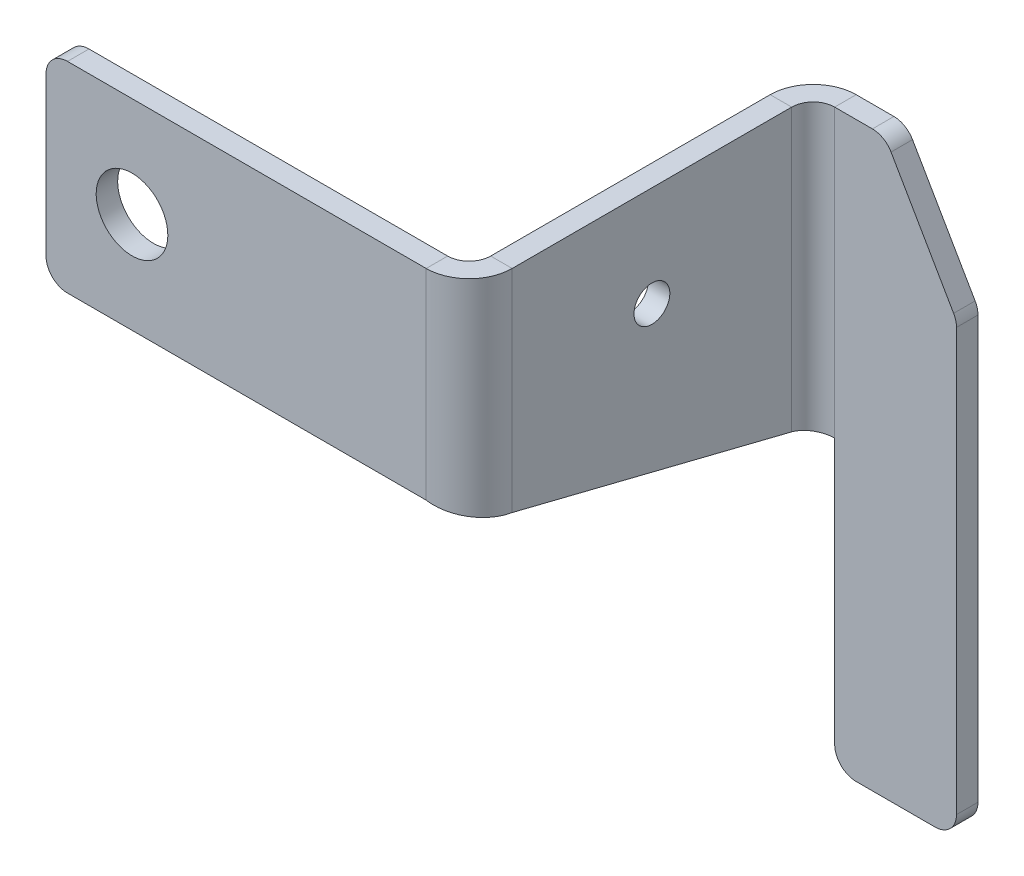
ISO-10303-21;
HEADER;
FILE_DESCRIPTION(('STEP AP214'),'2;1');
FILE_NAME('part.step','',(''),(''),'','','');
FILE_SCHEMA(('AUTOMOTIVE_DESIGN { 1 0 10303 214 1 1 1 1 }'));
ENDSEC;
DATA;
#1=APPLICATION_CONTEXT('core data for automotive mechanical design processes');
#2=APPLICATION_PROTOCOL_DEFINITION('international standard','automotive_design',2000,#1);
#3=PRODUCT_CONTEXT('',#1,'mechanical');
#4=PRODUCT('Part','Part','',(#3));
#5=PRODUCT_RELATED_PRODUCT_CATEGORY('part','',(#4));
#6=PRODUCT_DEFINITION_FORMATION('','',#4);
#7=PRODUCT_DEFINITION_CONTEXT('part definition',#1,'design');
#8=PRODUCT_DEFINITION('design','',#6,#7);
#9=PRODUCT_DEFINITION_SHAPE('','',#8);
#10=(LENGTH_UNIT() NAMED_UNIT(*) SI_UNIT(.MILLI.,.METRE.));
#11=(NAMED_UNIT(*) PLANE_ANGLE_UNIT() SI_UNIT($,.RADIAN.));
#12=(NAMED_UNIT(*) SI_UNIT($,.STERADIAN.) SOLID_ANGLE_UNIT());
#13=UNCERTAINTY_MEASURE_WITH_UNIT(LENGTH_MEASURE(1.E-05),#10,'distance_accuracy_value','');
#14=(GEOMETRIC_REPRESENTATION_CONTEXT(3) GLOBAL_UNCERTAINTY_ASSIGNED_CONTEXT((#13)) GLOBAL_UNIT_ASSIGNED_CONTEXT((#10,
#11,#12)) REPRESENTATION_CONTEXT('',''));
#15=CARTESIAN_POINT('',(0.,0.,0.));
#16=DIRECTION('',(0.,0.,1.));
#17=DIRECTION('',(1.,0.,0.));
#18=AXIS2_PLACEMENT_3D('',#15,#16,#17);
#19=CARTESIAN_POINT('',(-23.,0.,0.));
#20=DIRECTION('',(1.,0.,0.));
#21=DIRECTION('',(0.,0.,-1.));
#22=AXIS2_PLACEMENT_3D('',#19,#20,#21);
#23=PLANE('',#22);
#24=CARTESIAN_POINT('',(-23.0000000000001,66.,22.5));
#25=DIRECTION('',(-1.,0.,0.));
#26=DIRECTION('',(0.,0.,1.));
#27=AXIS2_PLACEMENT_3D('',#24,#25,#26);
#28=CIRCLE('',#27,2.5);
#29=CARTESIAN_POINT('',(-23.0000000000001,66.,25.));
#30=VERTEX_POINT('',#29);
#31=EDGE_CURVE('E578',#30,#30,#28,.T.);
#32=ORIENTED_EDGE('',*,*,#31,.F.);
#33=EDGE_LOOP('',(#32));
#34=FACE_BOUND('',#33,.T.);
#35=DIRECTION('',(0.,0.242535625036333,0.970142500145332));
#36=VECTOR('',#35,1.);
#37=CARTESIAN_POINT('',(-23.,37.6470588235294,-9.41176470588242));
#38=LINE('',#37,#36);
#39=CARTESIAN_POINT('',(-23.,40.75,2.99999999999998));
#40=VERTEX_POINT('',#39);
#41=CARTESIAN_POINT('',(-23.0000000000001,50.5,42.0000000000001));
#42=VERTEX_POINT('',#41);
#43=EDGE_CURVE('E445',#40,#42,#38,.T.);
#44=ORIENTED_EDGE('',*,*,#43,.T.);
#45=DIRECTION('',(0.,1.,0.));
#46=VECTOR('',#45,1.);
#47=CARTESIAN_POINT('',(-23.0000000000001,80.,42.));
#48=LINE('',#47,#46);
#49=CARTESIAN_POINT('',(-23.0000000000001,80.,42.));
#50=VERTEX_POINT('',#49);
#51=EDGE_CURVE('E248',#50,#42,#48,.F.);
#52=ORIENTED_EDGE('',*,*,#51,.F.);
#53=DIRECTION('',(0.,0.,-1.));
#54=VECTOR('',#53,1.);
#55=CARTESIAN_POINT('',(-23.,80.,0.));
#56=LINE('',#55,#54);
#57=CARTESIAN_POINT('',(-23.,80.,2.99999999999998));
#58=VERTEX_POINT('',#57);
#59=EDGE_CURVE('E267',#50,#58,#56,.T.);
#60=ORIENTED_EDGE('',*,*,#59,.T.);
#61=DIRECTION('',(0.,1.,0.));
#62=VECTOR('',#61,1.);
#63=CARTESIAN_POINT('',(-23.,0.,2.99999999999998));
#64=LINE('',#63,#62);
#65=EDGE_CURVE('E262',#40,#58,#64,.T.);
#66=ORIENTED_EDGE('',*,*,#65,.F.);
#67=EDGE_LOOP('',(#44,#52,#60,#66));
#68=FACE_BOUND('',#67,.T.);
#69=ADVANCED_FACE('F48',(#34,#68),#23,.F.);
#70=CARTESIAN_POINT('',(-20.,0.,0.));
#71=DIRECTION('',(1.,0.,0.));
#72=DIRECTION('',(0.,0.,-1.));
#73=AXIS2_PLACEMENT_3D('',#70,#71,#72);
#74=PLANE('',#73);
#75=CARTESIAN_POINT('',(-20.0000000000001,66.,22.5));
#76=DIRECTION('',(1.,0.,0.));
#77=DIRECTION('',(0.,0.,-1.));
#78=AXIS2_PLACEMENT_3D('',#75,#76,#77);
#79=CIRCLE('',#78,2.5);
#80=CARTESIAN_POINT('',(-20.0000000000001,66.,20.));
#81=VERTEX_POINT('',#80);
#82=EDGE_CURVE('E52',#81,#81,#79,.T.);
#83=ORIENTED_EDGE('',*,*,#82,.F.);
#84=EDGE_LOOP('',(#83));
#85=FACE_BOUND('',#84,.T.);
#86=DIRECTION('',(0.,1.,0.));
#87=VECTOR('',#86,1.);
#88=CARTESIAN_POINT('',(-20.0000000000001,80.,42.0000000000001));
#89=LINE('',#88,#87);
#90=CARTESIAN_POINT('',(-20.0000000000001,80.,42.0000000000001));
#91=VERTEX_POINT('',#90);
#92=CARTESIAN_POINT('',(-20.0000000000001,50.5,42.0000000000001));
#93=VERTEX_POINT('',#92);
#94=EDGE_CURVE('E244',#91,#93,#89,.F.);
#95=ORIENTED_EDGE('',*,*,#94,.T.);
#96=DIRECTION('',(0.,0.242535625036333,0.970142500145332));
#97=VECTOR('',#96,1.);
#98=CARTESIAN_POINT('',(-20.,37.6470588235294,-9.41176470588242));
#99=LINE('',#98,#97);
#100=CARTESIAN_POINT('',(-20.,40.75,2.99999999999999));
#101=VERTEX_POINT('',#100);
#102=EDGE_CURVE('E200',#101,#93,#99,.T.);
#103=ORIENTED_EDGE('',*,*,#102,.F.);
#104=DIRECTION('',(0.,-1.,0.));
#105=VECTOR('',#104,1.);
#106=CARTESIAN_POINT('',(-20.,80.,2.99999999999999));
#107=LINE('',#106,#105);
#108=CARTESIAN_POINT('',(-20.,80.,2.99999999999999));
#109=VERTEX_POINT('',#108);
#110=EDGE_CURVE('E259',#109,#101,#107,.T.);
#111=ORIENTED_EDGE('',*,*,#110,.F.);
#112=DIRECTION('',(0.,0.,-1.));
#113=VECTOR('',#112,1.);
#114=CARTESIAN_POINT('',(-20.,80.,0.));
#115=LINE('',#114,#113);
#116=EDGE_CURVE('E266',#91,#109,#115,.T.);
#117=ORIENTED_EDGE('',*,*,#116,.F.);
#118=EDGE_LOOP('',(#95,#103,#111,#117));
#119=FACE_BOUND('',#118,.T.);
#120=ADVANCED_FACE('F494',(#85,#119),#74,.T.);
#121=CARTESIAN_POINT('',(-17.,0.,3.));
#122=DIRECTION('',(0.,-1.,0.));
#123=DIRECTION('',(-1.,0.,0.));
#124=AXIS2_PLACEMENT_3D('',#121,#122,#123);
#125=CYLINDRICAL_SURFACE('',#124,6.);
#126=DIRECTION('',(0.,-1.,0.));
#127=VECTOR('',#126,1.);
#128=CARTESIAN_POINT('',(-17.,0.,-3.));
#129=LINE('',#128,#127);
#130=CARTESIAN_POINT('',(-17.,40.,-3.));
#131=VERTEX_POINT('',#130);
#132=CARTESIAN_POINT('',(-17.,80.,-3.));
#133=VERTEX_POINT('',#132);
#134=EDGE_CURVE('E275',#131,#133,#129,.F.);
#135=ORIENTED_EDGE('',*,*,#134,.F.);
#136=CARTESIAN_POINT('',(-17.,40.75,3.));
#137=DIRECTION('',(0.,0.992277876713668,-0.124034734589209));
#138=DIRECTION('',(0.,-0.124034734589209,-0.992277876713668));
#139=AXIS2_PLACEMENT_3D('',#136,#137,#138);
#140=ELLIPSE('',#139,6.04669331122391,6.);
#141=EDGE_CURVE('E403',#40,#131,#140,.F.);
#142=ORIENTED_EDGE('',*,*,#141,.F.);
#143=ORIENTED_EDGE('',*,*,#65,.T.);
#144=CARTESIAN_POINT('',(-17.,80.,3.));
#145=DIRECTION('',(0.,-1.,0.));
#146=DIRECTION('',(0.,0.,-1.));
#147=AXIS2_PLACEMENT_3D('',#144,#145,#146);
#148=CIRCLE('',#147,6.);
#149=EDGE_CURVE('E274',#133,#58,#148,.F.);
#150=ORIENTED_EDGE('',*,*,#149,.F.);
#151=EDGE_LOOP('',(#135,#142,#143,#150));
#152=FACE_BOUND('',#151,.T.);
#153=ADVANCED_FACE('F498',(#152),#125,.T.);
#154=CARTESIAN_POINT('',(-17.,0.,3.));
#155=DIRECTION('',(0.,-1.,0.));
#156=DIRECTION('',(-1.,0.,0.));
#157=AXIS2_PLACEMENT_3D('',#154,#155,#156);
#158=CYLINDRICAL_SURFACE('',#157,3.);
#159=CARTESIAN_POINT('',(-17.,40.75,3.));
#160=DIRECTION('',(0.,0.970142500145332,-0.242535625036333));
#161=DIRECTION('',(0.,-0.242535625036333,-0.970142500145332));
#162=AXIS2_PLACEMENT_3D('',#159,#160,#161);
#163=ELLIPSE('',#162,3.09232921921324,3.);
#164=CARTESIAN_POINT('',(-17.,40.,0.));
#165=VERTEX_POINT('',#164);
#166=EDGE_CURVE('E400',#101,#165,#163,.F.);
#167=ORIENTED_EDGE('',*,*,#166,.T.);
#168=DIRECTION('',(0.,-1.,0.));
#169=VECTOR('',#168,1.);
#170=CARTESIAN_POINT('',(-17.,0.,0.));
#171=LINE('',#170,#169);
#172=CARTESIAN_POINT('',(-17.,80.,0.));
#173=VERTEX_POINT('',#172);
#174=EDGE_CURVE('E270',#165,#173,#171,.F.);
#175=ORIENTED_EDGE('',*,*,#174,.T.);
#176=CARTESIAN_POINT('',(-17.,80.,3.));
#177=DIRECTION('',(0.,-1.,0.));
#178=DIRECTION('',(0.,0.,-1.));
#179=AXIS2_PLACEMENT_3D('',#176,#177,#178);
#180=CIRCLE('',#179,3.);
#181=EDGE_CURVE('E279',#173,#109,#180,.F.);
#182=ORIENTED_EDGE('',*,*,#181,.T.);
#183=ORIENTED_EDGE('',*,*,#110,.T.);
#184=EDGE_LOOP('',(#167,#175,#182,#183));
#185=FACE_BOUND('',#184,.T.);
#186=ADVANCED_FACE('F405',(#185),#158,.F.);
#187=CARTESIAN_POINT('',(-26.0000000000001,80.,42.));
#188=DIRECTION('',(0.,1.,0.));
#189=DIRECTION('',(0.,0.,1.));
#190=AXIS2_PLACEMENT_3D('',#187,#188,#189);
#191=CYLINDRICAL_SURFACE('',#190,6.00000000000002);
#192=DIRECTION('',(0.,-1.,0.));
#193=VECTOR('',#192,1.);
#194=CARTESIAN_POINT('',(-26.0000000000001,0.,48.0000000000002));
#195=LINE('',#194,#193);
#196=CARTESIAN_POINT('',(-26.0000000000001,80.,48.));
#197=VERTEX_POINT('',#196);
#198=CARTESIAN_POINT('',(-26.0000000000001,52.0000000000001,48.));
#199=VERTEX_POINT('',#198);
#200=EDGE_CURVE('E194',#197,#199,#195,.T.);
#201=ORIENTED_EDGE('',*,*,#200,.T.);
#202=CARTESIAN_POINT('',(-20.0000000000001,50.5,42.0000000000001));
#203=CARTESIAN_POINT('',(-19.9999809272732,50.5271988135765,42.1708884115336));
#204=CARTESIAN_POINT('',(-20.0072999109342,50.554397181265,42.3417741244732));
#205=CARTESIAN_POINT('',(-20.0364762501204,50.6087914012445,42.6822920448548));
#206=CARTESIAN_POINT('',(-20.0583328896161,50.6359872535932,42.8519243136171));
#207=CARTESIAN_POINT('',(-20.1164246131866,50.6903567100954,43.1885755944871));
#208=CARTESIAN_POINT('',(-20.1526486934209,50.7175303153643,43.3555965050813));
#209=CARTESIAN_POINT('',(-20.2392049399518,50.7718796544687,43.6859389510763));
#210=CARTESIAN_POINT('',(-20.289536930385,50.7990553882734,43.8492605325641));
#211=CARTESIAN_POINT('',(-20.4039645154131,50.853416377391,44.1710740863774));
#212=CARTESIAN_POINT('',(-20.4680649793588,50.8806016326666,44.3295643273504));
#213=CARTESIAN_POINT('',(-20.6095773554522,50.9349826984854,44.6405567010993));
#214=CARTESIAN_POINT('',(-20.6869941614229,50.9621785092287,44.7930566069973));
#215=CARTESIAN_POINT('',(-20.8545260998438,51.0165569814536,45.0908367943875));
#216=CARTESIAN_POINT('',(-20.9446363043459,51.0437396439496,45.236119848204));
#217=CARTESIAN_POINT('',(-21.1369226509117,51.0981060193544,45.5184731996396));
#218=CARTESIAN_POINT('',(-21.2390990480618,51.1252897322732,45.6555433235401));
#219=CARTESIAN_POINT('',(-21.4547676270201,51.1796585182956,45.9204637077973));
#220=CARTESIAN_POINT('',(-21.5682594316657,51.2068435913237,46.0483142752136));
#221=CARTESIAN_POINT('',(-21.8057347373319,51.2612132213563,46.2938690962732));
#222=CARTESIAN_POINT('',(-21.9297182416712,51.2883977783606,46.4115733467071));
#223=CARTESIAN_POINT('',(-22.1873052742819,51.3427731237444,46.6360054318254));
#224=CARTESIAN_POINT('',(-22.3209111828211,51.3699639119956,46.7427305346636));
#225=CARTESIAN_POINT('',(-22.5967387363472,51.4243428191225,46.9443906750948));
#226=CARTESIAN_POINT('',(-22.73896020153,51.4515309380421,47.0393259586118));
#227=CARTESIAN_POINT('',(-23.0310482738764,51.5059212937497,47.2167554377511));
#228=CARTESIAN_POINT('',(-23.1809182157006,51.5331235314881,47.299244143693));
#229=CARTESIAN_POINT('',(-23.4870951857911,51.5875184508545,47.4511009166432));
#230=CARTESIAN_POINT('',(-23.6433998426797,51.6147111323435,47.5204737654355));
#231=CARTESIAN_POINT('',(-23.9612955407474,51.6690862423085,47.645604209207));
#232=CARTESIAN_POINT('',(-24.122884396854,51.6962686704363,47.7013673531928));
#233=CARTESIAN_POINT('',(-24.4501747261215,51.7506221292656,47.7988968272606));
#234=CARTESIAN_POINT('',(-24.6158750284614,51.7777931610212,47.8406670940719));
#235=CARTESIAN_POINT('',(-24.9832093848779,51.8374945385136,47.9167441914123));
#236=CARTESIAN_POINT('',(-25.1854907718932,51.8700260149393,47.9479588860502));
#237=CARTESIAN_POINT('',(-25.5918555304715,51.935038985061,47.9895918504956));
#238=CARTESIAN_POINT('',(-25.7959355238922,51.9675204759518,48.000043121242));
#239=CARTESIAN_POINT('',(-26.0000000000001,52.,48.0000000000001));
#240=B_SPLINE_CURVE_WITH_KNOTS('',3,(#202,#203,#204,#205,#206,#207,#208,#209,#210,#211,#212,
#213,#214,#215,#216,#217,#218,#219,#220,#221,#222,#223,#224,#225,#226,#227,#228,#229,#230,#231,
#232,#233,#234,#235,#236,#237,#238,#239),.UNSPECIFIED.,.F.,.F.,(4,2,2,2,2,2,2,2,2,2,2,2,2,2,2,2,
2,2,4),(0.,0.518959550329575,1.0378935420111,1.55643085383316,2.07496170206937,2.5936762364725,
3.11258180997676,3.63128648157117,4.15000212085383,4.66870047619503,5.18739899560693,
5.70622626769461,6.22504271574306,6.74408732796646,7.26294234026479,7.78158544805828,
8.30008251901355,8.92074034643599,9.54041092196089),.UNSPECIFIED.);
#241=EDGE_CURVE('E212',#93,#199,#240,.T.);
#242=ORIENTED_EDGE('',*,*,#241,.F.);
#243=ORIENTED_EDGE('',*,*,#94,.F.);
#244=CARTESIAN_POINT('',(-26.0000000000001,80.,42.));
#245=DIRECTION('',(0.,1.,0.));
#246=DIRECTION('',(0.,0.,1.));
#247=AXIS2_PLACEMENT_3D('',#244,#245,#246);
#248=CIRCLE('',#247,6.00000000000002);
#249=EDGE_CURVE('E225',#197,#91,#248,.T.);
#250=ORIENTED_EDGE('',*,*,#249,.F.);
#251=EDGE_LOOP('',(#201,#242,#243,#250));
#252=FACE_BOUND('',#251,.T.);
#253=ADVANCED_FACE('F223',(#252),#191,.T.);
#254=CARTESIAN_POINT('',(-26.0000000000001,80.,42.));
#255=DIRECTION('',(0.,1.,0.));
#256=DIRECTION('',(0.,0.,1.));
#257=AXIS2_PLACEMENT_3D('',#254,#255,#256);
#258=CYLINDRICAL_SURFACE('',#257,3.00000000000002);
#259=CARTESIAN_POINT('',(-23.0000000000001,50.5,42.0000000000001));
#260=CARTESIAN_POINT('',(-22.9999900816324,50.5282067071287,42.0886098585475));
#261=CARTESIAN_POINT('',(-23.0039257862985,50.5564118260681,42.1772156494112));
#262=CARTESIAN_POINT('',(-23.0196122009743,50.6128193554078,42.3537286151159));
#263=CARTESIAN_POINT('',(-23.0313624967738,50.6410217658723,42.4416358267351));
#264=CARTESIAN_POINT('',(-23.0625895390688,50.697405074533,42.6160018487344));
#265=CARTESIAN_POINT('',(-23.0820601795823,50.7255859721383,42.7024617476013));
#266=CARTESIAN_POINT('',(-23.1285548790054,50.7819421245132,42.8732990209915));
#267=CARTESIAN_POINT('',(-23.1555788364569,50.8101173793535,42.9576764234709));
#268=CARTESIAN_POINT('',(-23.2477378209365,50.8946670540813,43.2067866102603));
#269=CARTESIAN_POINT('',(-23.3239710886862,50.9510850516398,43.3675591346964));
#270=CARTESIAN_POINT('',(-23.5035209009418,51.0638707755631,43.6730264769888));
#271=CARTESIAN_POINT('',(-23.6068307942003,51.1202385108672,43.8177252308805));
#272=CARTESIAN_POINT('',(-23.8372910770278,51.2329679353857,44.0866280437404));
#273=CARTESIAN_POINT('',(-23.964432402184,51.2893296187733,44.2108398613662));
#274=CARTESIAN_POINT('',(-24.2386625423282,51.4020656020957,44.4349659893948));
#275=CARTESIAN_POINT('',(-24.3857587485445,51.4584398989415,44.5348712582401));
#276=CARTESIAN_POINT('',(-24.6952860604841,51.5712113292956,44.7072371548024));
#277=CARTESIAN_POINT('',(-24.8577233815542,51.6276084627625,44.7796865988793));
#278=CARTESIAN_POINT('',(-25.1927315440526,51.7403622476882,44.8947538283525));
#279=CARTESIAN_POINT('',(-25.3652901289713,51.7967188677449,44.937406919457));
#280=CARTESIAN_POINT('',(-25.616201456582,51.8775412771971,44.976350764425));
#281=CARTESIAN_POINT('',(-25.6927625411078,51.9020560952089,44.9852215096041));
#282=CARTESIAN_POINT('',(-25.8462043645222,51.9510432094658,44.9970396467386));
#283=CARTESIAN_POINT('',(-25.9230842999591,51.9755155043361,44.9999974733351));
#284=CARTESIAN_POINT('',(-26.0000000000001,52.,45.0000000000001));
#285=B_SPLINE_CURVE_WITH_KNOTS('',3,(#259,#260,#261,#262,#263,#264,#265,#266,#267,#268,#269,
#270,#271,#272,#273,#274,#275,#276,#277,#278,#279,#280,#281,#282,#283,#284),.UNSPECIFIED.,.F.,
.F.,(4,2,2,2,2,2,2,2,2,2,2,2,4),(0.,0.27888193490708,0.55774908893085,0.836396126840666,
1.11503942207467,1.67213120677629,2.22908627251694,2.78582992570988,3.34278036102028,
3.89995741692172,4.45647314858612,4.69892817969104,4.94095496670209),.UNSPECIFIED.);
#286=CARTESIAN_POINT('',(-26.0000000000002,52.0000000000001,45.));
#287=VERTEX_POINT('',#286);
#288=EDGE_CURVE('E211',#42,#287,#285,.T.);
#289=ORIENTED_EDGE('',*,*,#288,.T.);
#290=DIRECTION('',(0.,1.,0.));
#291=VECTOR('',#290,1.);
#292=CARTESIAN_POINT('',(-26.0000000000001,40.,45.0000000000001));
#293=LINE('',#292,#291);
#294=CARTESIAN_POINT('',(-26.0000000000001,80.,45.));
#295=VERTEX_POINT('',#294);
#296=EDGE_CURVE('E233',#287,#295,#293,.T.);
#297=ORIENTED_EDGE('',*,*,#296,.T.);
#298=CARTESIAN_POINT('',(-26.0000000000001,80.,42.));
#299=DIRECTION('',(0.,1.,0.));
#300=DIRECTION('',(0.,0.,1.));
#301=AXIS2_PLACEMENT_3D('',#298,#299,#300);
#302=CIRCLE('',#301,3.00000000000002);
#303=EDGE_CURVE('E240',#295,#50,#302,.T.);
#304=ORIENTED_EDGE('',*,*,#303,.T.);
#305=ORIENTED_EDGE('',*,*,#51,.T.);
#306=EDGE_LOOP('',(#289,#297,#304,#305));
#307=FACE_BOUND('',#306,.T.);
#308=ADVANCED_FACE('F418',(#307),#258,.F.);
#309=CARTESIAN_POINT('',(0.,0.,48.0000000000002));
#310=DIRECTION('',(0.,0.,-1.));
#311=DIRECTION('',(0.,1.,0.));
#312=AXIS2_PLACEMENT_3D('',#309,#310,#311);
#313=PLANE('',#312);
#314=CARTESIAN_POINT('',(-67.0477038063071,66.,48.));
#315=DIRECTION('',(0.,0.,-1.));
#316=DIRECTION('',(0.,1.,0.));
#317=AXIS2_PLACEMENT_3D('',#314,#315,#316);
#318=CIRCLE('',#317,5.);
#319=CARTESIAN_POINT('',(-67.0477038063071,71.,48.));
#320=VERTEX_POINT('',#319);
#321=EDGE_CURVE('E306',#320,#320,#318,.T.);
#322=ORIENTED_EDGE('',*,*,#321,.T.);
#323=EDGE_LOOP('',(#322));
#324=FACE_BOUND('',#323,.T.);
#325=DIRECTION('',(-1.,0.,0.));
#326=VECTOR('',#325,1.);
#327=CARTESIAN_POINT('',(-79.0477038063071,80.,48.));
#328=LINE('',#327,#326);
#329=CARTESIAN_POINT('',(-76.0477038063071,80.,48.));
#330=VERTEX_POINT('',#329);
#331=EDGE_CURVE('E237',#197,#330,#328,.T.);
#332=ORIENTED_EDGE('',*,*,#331,.T.);
#333=CARTESIAN_POINT('',(-76.0477038063071,77.,48.));
#334=DIRECTION('',(0.,0.,-1.));
#335=DIRECTION('',(0.,1.,0.));
#336=AXIS2_PLACEMENT_3D('',#333,#334,#335);
#337=CIRCLE('',#336,3.);
#338=CARTESIAN_POINT('',(-79.0477038063071,77.,48.));
#339=VERTEX_POINT('',#338);
#340=EDGE_CURVE('E324',#330,#339,#337,.F.);
#341=ORIENTED_EDGE('',*,*,#340,.T.);
#342=DIRECTION('',(0.,-1.,0.));
#343=VECTOR('',#342,1.);
#344=CARTESIAN_POINT('',(-79.0477038063071,40.,48.0000000000001));
#345=LINE('',#344,#343);
#346=CARTESIAN_POINT('',(-79.0477038063071,55.0000000000001,48.));
#347=VERTEX_POINT('',#346);
#348=EDGE_CURVE('E239',#339,#347,#345,.T.);
#349=ORIENTED_EDGE('',*,*,#348,.T.);
#350=CARTESIAN_POINT('',(-76.0477038063071,55.0000000000001,48.));
#351=DIRECTION('',(0.,0.,-1.));
#352=DIRECTION('',(0.,1.,0.));
#353=AXIS2_PLACEMENT_3D('',#350,#351,#352);
#354=CIRCLE('',#353,3.);
#355=CARTESIAN_POINT('',(-76.0477038063071,52.0000000000001,48.));
#356=VERTEX_POINT('',#355);
#357=EDGE_CURVE('E197',#347,#356,#354,.F.);
#358=ORIENTED_EDGE('',*,*,#357,.T.);
#359=DIRECTION('',(1.,0.,0.));
#360=VECTOR('',#359,1.);
#361=CARTESIAN_POINT('',(0.,52.0000000000001,48.));
#362=LINE('',#361,#360);
#363=EDGE_CURVE('E189',#356,#199,#362,.T.);
#364=ORIENTED_EDGE('',*,*,#363,.T.);
#365=ORIENTED_EDGE('',*,*,#200,.F.);
#366=EDGE_LOOP('',(#332,#341,#349,#358,#364,#365));
#367=FACE_BOUND('',#366,.T.);
#368=ADVANCED_FACE('F192',(#324,#367),#313,.F.);
#369=CARTESIAN_POINT('',(0.,0.,45.0000000000001));
#370=DIRECTION('',(0.,0.,-1.));
#371=DIRECTION('',(0.,1.,0.));
#372=AXIS2_PLACEMENT_3D('',#369,#370,#371);
#373=PLANE('',#372);
#374=CARTESIAN_POINT('',(-67.0477038063071,66.,45.));
#375=DIRECTION('',(0.,0.,-1.));
#376=DIRECTION('',(0.,1.,0.));
#377=AXIS2_PLACEMENT_3D('',#374,#375,#376);
#378=CIRCLE('',#377,5.);
#379=CARTESIAN_POINT('',(-67.0477038063071,71.,45.));
#380=VERTEX_POINT('',#379);
#381=EDGE_CURVE('E303',#380,#380,#378,.T.);
#382=ORIENTED_EDGE('',*,*,#381,.F.);
#383=EDGE_LOOP('',(#382));
#384=FACE_BOUND('',#383,.T.);
#385=DIRECTION('',(0.,-1.,0.));
#386=VECTOR('',#385,1.);
#387=CARTESIAN_POINT('',(-79.0477038063071,40.,45.0000000000001));
#388=LINE('',#387,#386);
#389=CARTESIAN_POINT('',(-79.0477038063071,77.,45.));
#390=VERTEX_POINT('',#389);
#391=CARTESIAN_POINT('',(-79.0477038063071,55.0000000000001,45.));
#392=VERTEX_POINT('',#391);
#393=EDGE_CURVE('E231',#390,#392,#388,.T.);
#394=ORIENTED_EDGE('',*,*,#393,.F.);
#395=CARTESIAN_POINT('',(-76.0477038063071,77.,45.));
#396=DIRECTION('',(0.,0.,-1.));
#397=DIRECTION('',(0.,1.,0.));
#398=AXIS2_PLACEMENT_3D('',#395,#396,#397);
#399=CIRCLE('',#398,3.);
#400=CARTESIAN_POINT('',(-76.0477038063071,80.,45.));
#401=VERTEX_POINT('',#400);
#402=EDGE_CURVE('E319',#390,#401,#399,.T.);
#403=ORIENTED_EDGE('',*,*,#402,.T.);
#404=DIRECTION('',(-1.,0.,0.));
#405=VECTOR('',#404,1.);
#406=CARTESIAN_POINT('',(-79.0477038063071,80.,45.));
#407=LINE('',#406,#405);
#408=EDGE_CURVE('E227',#295,#401,#407,.T.);
#409=ORIENTED_EDGE('',*,*,#408,.F.);
#410=ORIENTED_EDGE('',*,*,#296,.F.);
#411=DIRECTION('',(1.,0.,0.));
#412=VECTOR('',#411,1.);
#413=CARTESIAN_POINT('',(-52.5238519031536,52.0000000000001,45.));
#414=LINE('',#413,#412);
#415=CARTESIAN_POINT('',(-76.0477038063071,52.0000000000001,45.));
#416=VERTEX_POINT('',#415);
#417=EDGE_CURVE('E201',#416,#287,#414,.T.);
#418=ORIENTED_EDGE('',*,*,#417,.F.);
#419=CARTESIAN_POINT('',(-76.0477038063071,55.0000000000001,45.));
#420=DIRECTION('',(0.,0.,-1.));
#421=DIRECTION('',(0.,1.,0.));
#422=AXIS2_PLACEMENT_3D('',#419,#420,#421);
#423=CIRCLE('',#422,3.);
#424=EDGE_CURVE('E317',#416,#392,#423,.T.);
#425=ORIENTED_EDGE('',*,*,#424,.T.);
#426=EDGE_LOOP('',(#394,#403,#409,#410,#418,#425));
#427=FACE_BOUND('',#426,.T.);
#428=ADVANCED_FACE('F429',(#384,#427),#373,.T.);
#429=CARTESIAN_POINT('',(-79.0477038063071,40.,48.0000000000001));
#430=DIRECTION('',(1.,0.,0.));
#431=DIRECTION('',(0.,0.,-1.));
#432=AXIS2_PLACEMENT_3D('',#429,#430,#431);
#433=PLANE('',#432);
#434=ORIENTED_EDGE('',*,*,#348,.F.);
#435=DIRECTION('',(0.,0.,-1.));
#436=VECTOR('',#435,1.);
#437=CARTESIAN_POINT('',(-79.0477038063071,77.,48.));
#438=LINE('',#437,#436);
#439=EDGE_CURVE('E314',#339,#390,#438,.T.);
#440=ORIENTED_EDGE('',*,*,#439,.T.);
#441=ORIENTED_EDGE('',*,*,#393,.T.);
#442=DIRECTION('',(0.,0.,-1.));
#443=VECTOR('',#442,1.);
#444=CARTESIAN_POINT('',(-79.0477038063071,55.0000000000001,48.));
#445=LINE('',#444,#443);
#446=EDGE_CURVE('E311',#392,#347,#445,.F.);
#447=ORIENTED_EDGE('',*,*,#446,.T.);
#448=EDGE_LOOP('',(#434,#440,#441,#447));
#449=FACE_BOUND('',#448,.T.);
#450=ADVANCED_FACE('F436',(#449),#433,.F.);
#451=CARTESIAN_POINT('',(-23.,80.,0.));
#452=DIRECTION('',(0.,-1.,0.));
#453=DIRECTION('',(0.,0.,-1.));
#454=AXIS2_PLACEMENT_3D('',#451,#452,#453);
#455=PLANE('',#454);
#456=DIRECTION('',(1.,0.,0.));
#457=VECTOR('',#456,1.);
#458=CARTESIAN_POINT('',(-23.0000000000001,80.,42.));
#459=LINE('',#458,#457);
#460=EDGE_CURVE('E246',#50,#91,#459,.T.);
#461=ORIENTED_EDGE('',*,*,#460,.T.);
#462=ORIENTED_EDGE('',*,*,#116,.T.);
#463=DIRECTION('',(-1.,0.,0.));
#464=VECTOR('',#463,1.);
#465=CARTESIAN_POINT('',(-20.,80.,2.99999999999999));
#466=LINE('',#465,#464);
#467=EDGE_CURVE('E258',#109,#58,#466,.T.);
#468=ORIENTED_EDGE('',*,*,#467,.T.);
#469=ORIENTED_EDGE('',*,*,#59,.F.);
#470=EDGE_LOOP('',(#461,#462,#468,#469));
#471=FACE_BOUND('',#470,.T.);
#472=ADVANCED_FACE('F480',(#471),#455,.F.);
#473=CARTESIAN_POINT('',(-20.,0.,-3.));
#474=DIRECTION('',(0.,-1.,0.));
#475=DIRECTION('',(0.,0.,-1.));
#476=AXIS2_PLACEMENT_3D('',#473,#474,#475);
#477=PLANE('',#476);
#478=DIRECTION('',(1.,0.,0.));
#479=VECTOR('',#478,1.);
#480=CARTESIAN_POINT('',(-20.,0.,0.));
#481=LINE('',#480,#479);
#482=CARTESIAN_POINT('',(-14.0000000000001,0.,0.));
#483=VERTEX_POINT('',#482);
#484=CARTESIAN_POINT('',(-3.,0.,0.));
#485=VERTEX_POINT('',#484);
#486=EDGE_CURVE('E291',#483,#485,#481,.T.);
#487=ORIENTED_EDGE('',*,*,#486,.F.);
#488=DIRECTION('',(0.,0.,-1.));
#489=VECTOR('',#488,1.);
#490=CARTESIAN_POINT('',(-14.0000000000001,0.,-3.));
#491=LINE('',#490,#489);
#492=CARTESIAN_POINT('',(-14.0000000000001,0.,-3.));
#493=VERTEX_POINT('',#492);
#494=EDGE_CURVE('E331',#483,#493,#491,.T.);
#495=ORIENTED_EDGE('',*,*,#494,.T.);
#496=DIRECTION('',(1.,0.,0.));
#497=VECTOR('',#496,1.);
#498=CARTESIAN_POINT('',(-20.,0.,-3.));
#499=LINE('',#498,#497);
#500=CARTESIAN_POINT('',(-3.,0.,-3.));
#501=VERTEX_POINT('',#500);
#502=EDGE_CURVE('E293',#493,#501,#499,.T.);
#503=ORIENTED_EDGE('',*,*,#502,.T.);
#504=DIRECTION('',(0.,0.,1.));
#505=VECTOR('',#504,1.);
#506=CARTESIAN_POINT('',(-3.,0.,-3.));
#507=LINE('',#506,#505);
#508=EDGE_CURVE('E328',#501,#485,#507,.T.);
#509=ORIENTED_EDGE('',*,*,#508,.T.);
#510=EDGE_LOOP('',(#487,#495,#503,#509));
#511=FACE_BOUND('',#510,.T.);
#512=ADVANCED_FACE('F381',(#511),#477,.T.);
#513=CARTESIAN_POINT('',(0.,0.,-3.));
#514=DIRECTION('',(0.,0.,-1.));
#515=DIRECTION('',(-1.,0.,0.));
#516=AXIS2_PLACEMENT_3D('',#513,#514,#515);
#517=PLANE('',#516);
#518=ORIENTED_EDGE('',*,*,#502,.F.);
#519=CARTESIAN_POINT('',(-14.0000000000001,3.,-3.));
#520=DIRECTION('',(0.,0.,-1.));
#521=DIRECTION('',(-1.,0.,0.));
#522=AXIS2_PLACEMENT_3D('',#519,#520,#521);
#523=CIRCLE('',#522,3.);
#524=CARTESIAN_POINT('',(-17.,3.,-3.));
#525=VERTEX_POINT('',#524);
#526=EDGE_CURVE('E340',#493,#525,#523,.T.);
#527=ORIENTED_EDGE('',*,*,#526,.T.);
#528=EDGE_CURVE('E272',#525,#131,#129,.F.);
#529=ORIENTED_EDGE('',*,*,#528,.T.);
#530=ORIENTED_EDGE('',*,*,#134,.T.);
#531=DIRECTION('',(-1.,0.,0.));
#532=VECTOR('',#531,1.);
#533=CARTESIAN_POINT('',(-20.,80.,-3.));
#534=LINE('',#533,#532);
#535=CARTESIAN_POINT('',(-11.7320508075689,80.,-3.));
#536=VERTEX_POINT('',#535);
#537=EDGE_CURVE('E290',#536,#133,#534,.T.);
#538=ORIENTED_EDGE('',*,*,#537,.F.);
#539=CARTESIAN_POINT('',(-11.7320508075689,77.,-3.));
#540=DIRECTION('',(0.,0.,-1.));
#541=DIRECTION('',(-1.,0.,0.));
#542=AXIS2_PLACEMENT_3D('',#539,#540,#541);
#543=CIRCLE('',#542,3.);
#544=CARTESIAN_POINT('',(-9.13397459621559,78.5,-3.));
#545=VERTEX_POINT('',#544);
#546=EDGE_CURVE('E336',#536,#545,#543,.T.);
#547=ORIENTED_EDGE('',*,*,#546,.T.);
#548=DIRECTION('',(-0.500000000000002,0.866025403784438,0.));
#549=VECTOR('',#548,1.);
#550=CARTESIAN_POINT('',(27.1410161513776,15.6698729810779,-3.));
#551=LINE('',#550,#549);
#552=CARTESIAN_POINT('',(-0.401923788646699,63.3756443470179,-3.));
#553=VERTEX_POINT('',#552);
#554=EDGE_CURVE('E308',#545,#553,#551,.F.);
#555=ORIENTED_EDGE('',*,*,#554,.T.);
#556=CARTESIAN_POINT('',(-3.,61.8756443470179,-3.));
#557=DIRECTION('',(0.,0.,-1.));
#558=DIRECTION('',(-1.,0.,0.));
#559=AXIS2_PLACEMENT_3D('',#556,#557,#558);
#560=CIRCLE('',#559,3.);
#561=CARTESIAN_POINT('',(0.,61.8756443470179,-3.));
#562=VERTEX_POINT('',#561);
#563=EDGE_CURVE('E334',#553,#562,#560,.T.);
#564=ORIENTED_EDGE('',*,*,#563,.T.);
#565=DIRECTION('',(0.,1.,0.));
#566=VECTOR('',#565,1.);
#567=CARTESIAN_POINT('',(0.,0.,-3.));
#568=LINE('',#567,#566);
#569=CARTESIAN_POINT('',(0.,3.,-3.));
#570=VERTEX_POINT('',#569);
#571=EDGE_CURVE('E287',#570,#562,#568,.T.);
#572=ORIENTED_EDGE('',*,*,#571,.F.);
#573=CARTESIAN_POINT('',(-3.,3.,-3.));
#574=DIRECTION('',(0.,0.,-1.));
#575=DIRECTION('',(-1.,0.,0.));
#576=AXIS2_PLACEMENT_3D('',#573,#574,#575);
#577=CIRCLE('',#576,3.);
#578=EDGE_CURVE('E338',#570,#501,#577,.T.);
#579=ORIENTED_EDGE('',*,*,#578,.T.);
#580=EDGE_LOOP('',(#518,#527,#529,#530,#538,#547,#555,#564,#572,#579));
#581=FACE_BOUND('',#580,.T.);
#582=ADVANCED_FACE('F365',(#581),#517,.T.);
#583=CARTESIAN_POINT('',(0.,0.,0.));
#584=DIRECTION('',(0.,0.,-1.));
#585=DIRECTION('',(-1.,0.,0.));
#586=AXIS2_PLACEMENT_3D('',#583,#584,#585);
#587=PLANE('',#586);
#588=CARTESIAN_POINT('',(-17.,3.,0.));
#589=VERTEX_POINT('',#588);
#590=EDGE_CURVE('E282',#589,#165,#171,.F.);
#591=ORIENTED_EDGE('',*,*,#590,.F.);
#592=CARTESIAN_POINT('',(-14.0000000000001,3.,0.));
#593=DIRECTION('',(0.,0.,-1.));
#594=DIRECTION('',(-1.,0.,0.));
#595=AXIS2_PLACEMENT_3D('',#592,#593,#594);
#596=CIRCLE('',#595,3.);
#597=EDGE_CURVE('E349',#589,#483,#596,.F.);
#598=ORIENTED_EDGE('',*,*,#597,.T.);
#599=ORIENTED_EDGE('',*,*,#486,.T.);
#600=CARTESIAN_POINT('',(-3.,3.,0.));
#601=DIRECTION('',(0.,0.,-1.));
#602=DIRECTION('',(-1.,0.,0.));
#603=AXIS2_PLACEMENT_3D('',#600,#601,#602);
#604=CIRCLE('',#603,3.);
#605=CARTESIAN_POINT('',(0.,3.,0.));
#606=VERTEX_POINT('',#605);
#607=EDGE_CURVE('E347',#485,#606,#604,.F.);
#608=ORIENTED_EDGE('',*,*,#607,.T.);
#609=DIRECTION('',(0.,1.,0.));
#610=VECTOR('',#609,1.);
#611=CARTESIAN_POINT('',(0.,0.,0.));
#612=LINE('',#611,#610);
#613=CARTESIAN_POINT('',(0.,61.8756443470179,0.));
#614=VERTEX_POINT('',#613);
#615=EDGE_CURVE('E286',#606,#614,#612,.T.);
#616=ORIENTED_EDGE('',*,*,#615,.T.);
#617=CARTESIAN_POINT('',(-3.,61.8756443470179,0.));
#618=DIRECTION('',(0.,0.,-1.));
#619=DIRECTION('',(-1.,0.,0.));
#620=AXIS2_PLACEMENT_3D('',#617,#618,#619);
#621=CIRCLE('',#620,3.);
#622=CARTESIAN_POINT('',(-0.40192378864669,63.3756443470179,0.));
#623=VERTEX_POINT('',#622);
#624=EDGE_CURVE('E344',#614,#623,#621,.F.);
#625=ORIENTED_EDGE('',*,*,#624,.T.);
#626=DIRECTION('',(0.500000000000002,-0.866025403784438,0.));
#627=VECTOR('',#626,1.);
#628=CARTESIAN_POINT('',(0.,62.6794919243113,0.));
#629=LINE('',#628,#627);
#630=CARTESIAN_POINT('',(-9.13397459621558,78.5,0.));
#631=VERTEX_POINT('',#630);
#632=EDGE_CURVE('E296',#623,#631,#629,.F.);
#633=ORIENTED_EDGE('',*,*,#632,.T.);
#634=CARTESIAN_POINT('',(-11.7320508075689,77.,0.));
#635=DIRECTION('',(0.,0.,-1.));
#636=DIRECTION('',(-1.,0.,0.));
#637=AXIS2_PLACEMENT_3D('',#634,#635,#636);
#638=CIRCLE('',#637,3.);
#639=CARTESIAN_POINT('',(-11.7320508075689,80.,0.));
#640=VERTEX_POINT('',#639);
#641=EDGE_CURVE('E64',#631,#640,#638,.F.);
#642=ORIENTED_EDGE('',*,*,#641,.T.);
#643=DIRECTION('',(-1.,0.,0.));
#644=VECTOR('',#643,1.);
#645=CARTESIAN_POINT('',(-20.,80.,0.));
#646=LINE('',#645,#644);
#647=EDGE_CURVE('E299',#640,#173,#646,.T.);
#648=ORIENTED_EDGE('',*,*,#647,.T.);
#649=ORIENTED_EDGE('',*,*,#174,.F.);
#650=EDGE_LOOP('',(#591,#598,#599,#608,#616,#625,#633,#642,#648,#649));
#651=FACE_BOUND('',#650,.T.);
#652=ADVANCED_FACE('F374',(#651),#587,.F.);
#653=CARTESIAN_POINT('',(0.,0.,-3.));
#654=DIRECTION('',(1.,0.,0.));
#655=DIRECTION('',(0.,0.,-1.));
#656=AXIS2_PLACEMENT_3D('',#653,#654,#655);
#657=PLANE('',#656);
#658=ORIENTED_EDGE('',*,*,#615,.F.);
#659=DIRECTION('',(0.,0.,1.));
#660=VECTOR('',#659,1.);
#661=CARTESIAN_POINT('',(0.,3.,-3.));
#662=LINE('',#661,#660);
#663=EDGE_CURVE('E354',#606,#570,#662,.F.);
#664=ORIENTED_EDGE('',*,*,#663,.T.);
#665=ORIENTED_EDGE('',*,*,#571,.T.);
#666=DIRECTION('',(0.,0.,-1.));
#667=VECTOR('',#666,1.);
#668=CARTESIAN_POINT('',(0.,61.8756443470179,-3.));
#669=LINE('',#668,#667);
#670=EDGE_CURVE('E351',#562,#614,#669,.F.);
#671=ORIENTED_EDGE('',*,*,#670,.T.);
#672=EDGE_LOOP('',(#658,#664,#665,#671));
#673=FACE_BOUND('',#672,.T.);
#674=ADVANCED_FACE('F371',(#673),#657,.T.);
#675=CARTESIAN_POINT('',(-20.,80.,-3.));
#676=DIRECTION('',(0.,1.,0.));
#677=DIRECTION('',(0.,0.,1.));
#678=AXIS2_PLACEMENT_3D('',#675,#676,#677);
#679=PLANE('',#678);
#680=ORIENTED_EDGE('',*,*,#647,.F.);
#681=DIRECTION('',(0.,0.,1.));
#682=VECTOR('',#681,1.);
#683=CARTESIAN_POINT('',(-11.7320508075689,80.,-3.));
#684=LINE('',#683,#682);
#685=EDGE_CURVE('E356',#640,#536,#684,.F.);
#686=ORIENTED_EDGE('',*,*,#685,.T.);
#687=ORIENTED_EDGE('',*,*,#537,.T.);
#688=DIRECTION('',(0.,0.,-1.));
#689=VECTOR('',#688,1.);
#690=CARTESIAN_POINT('',(-17.,80.,0.));
#691=LINE('',#690,#689);
#692=EDGE_CURVE('E278',#173,#133,#691,.T.);
#693=ORIENTED_EDGE('',*,*,#692,.F.);
#694=EDGE_LOOP('',(#680,#686,#687,#693));
#695=FACE_BOUND('',#694,.T.);
#696=ADVANCED_FACE('F510',(#695),#679,.T.);
#697=CARTESIAN_POINT('',(-17.,80.,3.));
#698=DIRECTION('',(0.,1.,0.));
#699=DIRECTION('',(0.,0.,1.));
#700=AXIS2_PLACEMENT_3D('',#697,#698,#699);
#701=PLANE('',#700);
#702=ORIENTED_EDGE('',*,*,#467,.F.);
#703=ORIENTED_EDGE('',*,*,#181,.F.);
#704=ORIENTED_EDGE('',*,*,#692,.T.);
#705=ORIENTED_EDGE('',*,*,#149,.T.);
#706=EDGE_LOOP('',(#702,#703,#704,#705));
#707=FACE_BOUND('',#706,.T.);
#708=ADVANCED_FACE('F491',(#707),#701,.T.);
#709=CARTESIAN_POINT('',(-17.0000000000001,0.,-3.));
#710=DIRECTION('',(1.,0.,0.));
#711=DIRECTION('',(0.,1.,0.));
#712=AXIS2_PLACEMENT_3D('',#709,#710,#711);
#713=PLANE('',#712);
#714=ORIENTED_EDGE('',*,*,#528,.F.);
#715=DIRECTION('',(0.,0.,-1.));
#716=VECTOR('',#715,1.);
#717=CARTESIAN_POINT('',(-17.0000000000001,3.,0.));
#718=LINE('',#717,#716);
#719=EDGE_CURVE('E342',#525,#589,#718,.F.);
#720=ORIENTED_EDGE('',*,*,#719,.T.);
#721=ORIENTED_EDGE('',*,*,#590,.T.);
#722=DIRECTION('',(0.,0.,1.));
#723=VECTOR('',#722,1.);
#724=CARTESIAN_POINT('',(-17.,40.,-3.));
#725=LINE('',#724,#723);
#726=EDGE_CURVE('E255',#131,#165,#725,.T.);
#727=ORIENTED_EDGE('',*,*,#726,.F.);
#728=EDGE_LOOP('',(#714,#720,#721,#727));
#729=FACE_BOUND('',#728,.T.);
#730=ADVANCED_FACE('F390',(#729),#713,.F.);
#731=CARTESIAN_POINT('',(-26.0000000000001,80.,42.));
#732=DIRECTION('',(0.,-1.,0.));
#733=DIRECTION('',(0.,0.,-1.));
#734=AXIS2_PLACEMENT_3D('',#731,#732,#733);
#735=PLANE('',#734);
#736=ORIENTED_EDGE('',*,*,#303,.F.);
#737=DIRECTION('',(0.,0.,1.));
#738=VECTOR('',#737,1.);
#739=CARTESIAN_POINT('',(-26.0000000000001,80.,45.));
#740=LINE('',#739,#738);
#741=EDGE_CURVE('E228',#295,#197,#740,.T.);
#742=ORIENTED_EDGE('',*,*,#741,.T.);
#743=ORIENTED_EDGE('',*,*,#249,.T.);
#744=ORIENTED_EDGE('',*,*,#460,.F.);
#745=EDGE_LOOP('',(#736,#742,#743,#744));
#746=FACE_BOUND('',#745,.T.);
#747=ADVANCED_FACE('F424',(#746),#735,.F.);
#748=CARTESIAN_POINT('',(-79.0477038063071,80.,48.));
#749=DIRECTION('',(0.,-1.,0.));
#750=DIRECTION('',(0.,0.,-1.));
#751=AXIS2_PLACEMENT_3D('',#748,#749,#750);
#752=PLANE('',#751);
#753=ORIENTED_EDGE('',*,*,#408,.T.);
#754=DIRECTION('',(0.,0.,-1.));
#755=VECTOR('',#754,1.);
#756=CARTESIAN_POINT('',(-76.0477038063071,80.,48.));
#757=LINE('',#756,#755);
#758=EDGE_CURVE('E321',#401,#330,#757,.F.);
#759=ORIENTED_EDGE('',*,*,#758,.T.);
#760=ORIENTED_EDGE('',*,*,#331,.F.);
#761=ORIENTED_EDGE('',*,*,#741,.F.);
#762=EDGE_LOOP('',(#753,#759,#760,#761));
#763=FACE_BOUND('',#762,.T.);
#764=ADVANCED_FACE('F426',(#763),#752,.F.);
#765=CARTESIAN_POINT('',(-17.,40.,-3.));
#766=CARTESIAN_POINT('',(-17.,40.,-2.));
#767=CARTESIAN_POINT('',(-17.,40.,-1.));
#768=CARTESIAN_POINT('',(-17.,40.,0.));
#769=CARTESIAN_POINT('',(-4.99999999999999,40.,-2.99999999999996));
#770=CARTESIAN_POINT('',(-7.,40.,-1.99999999999997));
#771=CARTESIAN_POINT('',(-9.,40.,-0.999999999999973));
#772=CARTESIAN_POINT('',(-11.,40.,0.));
#773=CARTESIAN_POINT('',(-5.00000000000004,41.5,9.00000000000004));
#774=CARTESIAN_POINT('',(-7.00000000000003,41.5,8.00000000000004));
#775=CARTESIAN_POINT('',(-9.00000000000003,41.5,7.00000000000003));
#776=CARTESIAN_POINT('',(-11.,41.5,6.00000000000002));
#777=CARTESIAN_POINT('',(-17.,41.5,9.));
#778=CARTESIAN_POINT('',(-17.,41.5,8.));
#779=CARTESIAN_POINT('',(-17.,41.5,7.));
#780=CARTESIAN_POINT('',(-17.,41.5,6.));
#781=CARTESIAN_POINT('',(-29.,41.5,8.99999999999996));
#782=CARTESIAN_POINT('',(-27.,41.5,7.99999999999997));
#783=CARTESIAN_POINT('',(-25.,41.5,6.99999999999997));
#784=CARTESIAN_POINT('',(-23.,41.5,5.99999999999998));
#785=CARTESIAN_POINT('',(-29.,40.,-3.00000000000004));
#786=CARTESIAN_POINT('',(-27.,40.,-2.00000000000004));
#787=CARTESIAN_POINT('',(-25.,40.,-1.00000000000003));
#788=CARTESIAN_POINT('',(-23.,40.,0.));
#789=CARTESIAN_POINT('',(-17.,40.,-3.));
#790=CARTESIAN_POINT('',(-17.,40.,-2.));
#791=CARTESIAN_POINT('',(-17.,40.,-1.));
#792=CARTESIAN_POINT('',(-17.,40.,0.));
#793=(BOUNDED_SURFACE() B_SPLINE_SURFACE(3,3,((#765,#766,#767,#768),(#769,#770,#771,#772),(#773,
#774,#775,#776),(#777,#778,#779,#780),(#781,#782,#783,#784),(#785,#786,#787,#788),(#789,#790,
#791,#792)),.UNSPECIFIED.,.T.,.F.,.F.) B_SPLINE_SURFACE_WITH_KNOTS((4,3,4),(4,4),(0.,0.5,1.),
(0.,1.),.UNSPECIFIED.) GEOMETRIC_REPRESENTATION_ITEM() RATIONAL_B_SPLINE_SURFACE(((1.,1.,1.,1.),
(0.333333333333333,0.333333333333333,0.333333333333333,0.333333333333333),(0.333333333333333,
0.333333333333333,0.333333333333333,0.333333333333333),(1.,1.,1.,1.),(0.333333333333333,
0.333333333333333,0.333333333333333,0.333333333333333),(0.333333333333333,0.333333333333333,
0.333333333333333,0.333333333333333),(1.,1.,1.,1.))) REPRESENTATION_ITEM('') SURFACE());
#794=DIRECTION('',(1.,0.,0.));
#795=VECTOR('',#794,1.);
#796=CARTESIAN_POINT('',(-20.,40.75,2.99999999999999));
#797=LINE('',#796,#795);
#798=EDGE_CURVE('E409',#101,#40,#797,.F.);
#799=ORIENTED_EDGE('',*,*,#726,.T.);
#800=ORIENTED_EDGE('',*,*,#166,.F.);
#801=ORIENTED_EDGE('',*,*,#798,.T.);
#802=ORIENTED_EDGE('',*,*,#141,.T.);
#803=EDGE_LOOP('',(#799,#800,#801,#802));
#804=FACE_BOUND('',#803,.T.);
#805=ADVANCED_FACE('F398',(#804),#793,.T.);
#806=CARTESIAN_POINT('',(-19.9697000000001,50.5,42.0000000000001));
#807=CARTESIAN_POINT('',(-19.9697000000001,50.625021995708,42.789503276548));
#808=CARTESIAN_POINT('',(-20.1266525678872,50.75,43.5784182670519));
#809=CARTESIAN_POINT('',(-20.7308059423075,51.,45.0369735373307));
#810=CARTESIAN_POINT('',(-21.1777690402864,51.125,45.7059010854648));
#811=CARTESIAN_POINT('',(-22.2940989145354,51.375,46.8222309597138));
#812=CARTESIAN_POINT('',(-22.9630264626695,51.5,47.2691940576927));
#813=CARTESIAN_POINT('',(-24.4215817329484,51.75,47.873347432113));
#814=CARTESIAN_POINT('',(-25.2104967234522,51.8749780042921,48.0303000000001));
#815=CARTESIAN_POINT('',(-26.0000000000001,52.,48.0303000000001));
#816=CARTESIAN_POINT('',(-20.0000000000001,50.5,42.0000000000001));
#817=CARTESIAN_POINT('',(-20.0000000000001,50.6250219803899,42.7855362702601));
#818=CARTESIAN_POINT('',(-20.1561639399902,50.75,43.5704873061558));
#819=CARTESIAN_POINT('',(-20.7572816698746,51.,45.0217138822255));
#820=CARTESIAN_POINT('',(-21.2019989456111,51.125,45.6872803198496));
#821=CARTESIAN_POINT('',(-22.3127196801507,51.375,46.7980010543891));
#822=CARTESIAN_POINT('',(-22.9782861177747,51.5,47.2427183301256));
#823=CARTESIAN_POINT('',(-24.4295126938445,51.75,47.8438360600099));
#824=CARTESIAN_POINT('',(-25.2144637297401,51.8749780196102,48.0000000000001));
#825=CARTESIAN_POINT('',(-26.0000000000001,52.,48.0000000000001));
#826=CARTESIAN_POINT('',(-23.0000000000001,50.5,42.0000000000001));
#827=CARTESIAN_POINT('',(-23.0000000000001,50.6250204637484,42.3927633704605));
#828=CARTESIAN_POINT('',(-23.0780819699952,50.75,42.7852436530779));
#829=CARTESIAN_POINT('',(-23.3786408349374,51.,43.5108569411128));
#830=CARTESIAN_POINT('',(-23.6009994728056,51.125,43.8436401599248));
#831=CARTESIAN_POINT('',(-24.1563598400754,51.375,44.3990005271946));
#832=CARTESIAN_POINT('',(-24.4891430588874,51.5,44.6213591650628));
#833=CARTESIAN_POINT('',(-25.2147563469223,51.75,44.921918030005));
#834=CARTESIAN_POINT('',(-25.6072366295397,51.8749795362516,45.0000000000001));
#835=CARTESIAN_POINT('',(-26.0000000000001,52.,45.0000000000001));
#836=CARTESIAN_POINT('',(-23.0300000000001,50.5,42.0000000000001));
#837=CARTESIAN_POINT('',(-23.0300000000001,50.625020448582,42.3888356414625));
#838=CARTESIAN_POINT('',(-23.1073011502952,50.75,42.7773912165471));
#839=CARTESIAN_POINT('',(-23.404854426588,51.,43.4957483717016));
#840=CARTESIAN_POINT('',(-23.6249894780775,51.125,43.8252037583256));
#841=CARTESIAN_POINT('',(-24.1747962416746,51.375,44.3750105219226));
#842=CARTESIAN_POINT('',(-24.5042516282986,51.5,44.5951455734122));
#843=CARTESIAN_POINT('',(-25.2226087834531,51.75,44.8926988497049));
#844=CARTESIAN_POINT('',(-25.6111643585377,51.874979551418,44.97));
#845=CARTESIAN_POINT('',(-26.0000000000001,52.,44.97));
#846=B_SPLINE_SURFACE_WITH_KNOTS('',1,3,((#806,#807,#808,#809,#810,#811,#812,#813,#814,#815),
(#816,#817,#818,#819,#820,#821,#822,#823,#824,#825),(#826,#827,#828,#829,#830,#831,#832,#833,
#834,#835),(#836,#837,#838,#839,#840,#841,#842,#843,#844,#845)),.UNSPECIFIED.,.F.,.F.,.F.,(2,1,
1,2),(4,2,2,2,4),(-0.0101,0.,1.,1.01),(0.,0.25,0.5,0.75,1.),.UNSPECIFIED.);
#847=DIRECTION('',(1.,0.,0.));
#848=VECTOR('',#847,1.);
#849=CARTESIAN_POINT('',(-23.0000000000001,50.5,42.0000000000001));
#850=LINE('',#849,#848);
#851=CARTESIAN_POINT('',(-22.1802885927285,50.5,42.0000000000001));
#852=VERTEX_POINT('',#851);
#853=EDGE_CURVE('E221',#42,#852,#850,.T.);
#854=DIRECTION('',(1.,0.,0.));
#855=VECTOR('',#854,1.);
#856=CARTESIAN_POINT('',(-23.0000000000001,50.5,42.0000000000001));
#857=LINE('',#856,#855);
#858=EDGE_CURVE('E218',#93,#852,#857,.F.);
#859=DIRECTION('',(0.,0.,1.));
#860=VECTOR('',#859,1.);
#861=CARTESIAN_POINT('',(-26.0000000000002,52.,48.));
#862=LINE('',#861,#860);
#863=EDGE_CURVE('E204',#199,#287,#862,.F.);
#864=ORIENTED_EDGE('',*,*,#853,.T.);
#865=ORIENTED_EDGE('',*,*,#858,.F.);
#866=ORIENTED_EDGE('',*,*,#241,.T.);
#867=ORIENTED_EDGE('',*,*,#863,.T.);
#868=ORIENTED_EDGE('',*,*,#288,.F.);
#869=EDGE_LOOP('',(#864,#865,#866,#867,#868));
#870=FACE_BOUND('',#869,.T.);
#871=ADVANCED_FACE('F216',(#870),#846,.F.);
#872=CARTESIAN_POINT('',(-23.,37.6470588235294,-9.41176470588242));
#873=DIRECTION('',(0.,0.970142500145332,-0.242535625036333));
#874=DIRECTION('',(0.,0.242535625036333,0.970142500145332));
#875=AXIS2_PLACEMENT_3D('',#872,#873,#874);
#876=PLANE('',#875);
#877=ORIENTED_EDGE('',*,*,#798,.F.);
#878=ORIENTED_EDGE('',*,*,#102,.T.);
#879=ORIENTED_EDGE('',*,*,#858,.T.);
#880=ORIENTED_EDGE('',*,*,#853,.F.);
#881=ORIENTED_EDGE('',*,*,#43,.F.);
#882=EDGE_LOOP('',(#877,#878,#879,#880,#881));
#883=FACE_BOUND('',#882,.T.);
#884=ADVANCED_FACE('F552',(#883),#876,.F.);
#885=CARTESIAN_POINT('',(0.,52.0000000000001,48.));
#886=DIRECTION('',(0.,1.,0.));
#887=DIRECTION('',(1.,0.,0.));
#888=AXIS2_PLACEMENT_3D('',#885,#886,#887);
#889=PLANE('',#888);
#890=ORIENTED_EDGE('',*,*,#363,.F.);
#891=DIRECTION('',(0.,0.,1.));
#892=VECTOR('',#891,1.);
#893=CARTESIAN_POINT('',(-76.0477038063071,52.0000000000001,45.));
#894=LINE('',#893,#892);
#895=EDGE_CURVE('E326',#356,#416,#894,.F.);
#896=ORIENTED_EDGE('',*,*,#895,.T.);
#897=ORIENTED_EDGE('',*,*,#417,.T.);
#898=ORIENTED_EDGE('',*,*,#863,.F.);
#899=EDGE_LOOP('',(#890,#896,#897,#898));
#900=FACE_BOUND('',#899,.T.);
#901=ADVANCED_FACE('F206',(#900),#889,.F.);
#902=CARTESIAN_POINT('',(-67.0477038063071,66.,-3.));
#903=DIRECTION('',(0.,0.,1.));
#904=DIRECTION('',(1.,0.,0.));
#905=AXIS2_PLACEMENT_3D('',#902,#903,#904);
#906=CYLINDRICAL_SURFACE('',#905,5.);
#907=ORIENTED_EDGE('',*,*,#381,.T.);
#908=EDGE_LOOP('',(#907));
#909=FACE_BOUND('',#908,.T.);
#910=ORIENTED_EDGE('',*,*,#321,.F.);
#911=EDGE_LOOP('',(#910));
#912=FACE_BOUND('',#911,.T.);
#913=ADVANCED_FACE('F528',(#909,#912),#906,.F.);
#914=CARTESIAN_POINT('',(0.,62.6794919243113,-3.));
#915=DIRECTION('',(-0.866025403784438,-0.500000000000001,0.));
#916=DIRECTION('',(0.,0.,1.));
#917=AXIS2_PLACEMENT_3D('',#914,#915,#916);
#918=PLANE('',#917);
#919=ORIENTED_EDGE('',*,*,#554,.F.);
#920=DIRECTION('',(0.,0.,-1.));
#921=VECTOR('',#920,1.);
#922=CARTESIAN_POINT('',(-9.13397459621558,78.5,-3.));
#923=LINE('',#922,#921);
#924=EDGE_CURVE('E12',#545,#631,#923,.F.);
#925=ORIENTED_EDGE('',*,*,#924,.T.);
#926=ORIENTED_EDGE('',*,*,#632,.F.);
#927=DIRECTION('',(0.,0.,1.));
#928=VECTOR('',#927,1.);
#929=CARTESIAN_POINT('',(-0.401923788646689,63.3756443470179,-3.));
#930=LINE('',#929,#928);
#931=EDGE_CURVE('E57',#623,#553,#930,.F.);
#932=ORIENTED_EDGE('',*,*,#931,.T.);
#933=EDGE_LOOP('',(#919,#925,#926,#932));
#934=FACE_BOUND('',#933,.T.);
#935=ADVANCED_FACE('F360',(#934),#918,.F.);
#936=CARTESIAN_POINT('',(-76.0477038063071,77.,48.));
#937=DIRECTION('',(0.,0.,-1.));
#938=DIRECTION('',(0.,1.,0.));
#939=AXIS2_PLACEMENT_3D('',#936,#937,#938);
#940=CYLINDRICAL_SURFACE('',#939,3.);
#941=ORIENTED_EDGE('',*,*,#340,.F.);
#942=ORIENTED_EDGE('',*,*,#758,.F.);
#943=ORIENTED_EDGE('',*,*,#402,.F.);
#944=ORIENTED_EDGE('',*,*,#439,.F.);
#945=EDGE_LOOP('',(#941,#942,#943,#944));
#946=FACE_BOUND('',#945,.T.);
#947=ADVANCED_FACE('F433',(#946),#940,.T.);
#948=CARTESIAN_POINT('',(-76.0477038063071,55.0000000000001,48.));
#949=DIRECTION('',(0.,0.,1.));
#950=DIRECTION('',(0.,-1.,0.));
#951=AXIS2_PLACEMENT_3D('',#948,#949,#950);
#952=CYLINDRICAL_SURFACE('',#951,3.);
#953=ORIENTED_EDGE('',*,*,#424,.F.);
#954=ORIENTED_EDGE('',*,*,#895,.F.);
#955=ORIENTED_EDGE('',*,*,#357,.F.);
#956=ORIENTED_EDGE('',*,*,#446,.F.);
#957=EDGE_LOOP('',(#953,#954,#955,#956));
#958=FACE_BOUND('',#957,.T.);
#959=ADVANCED_FACE('F440',(#958),#952,.T.);
#960=CARTESIAN_POINT('',(-14.0000000000001,3.,-3.));
#961=DIRECTION('',(0.,0.,1.));
#962=DIRECTION('',(1.,0.,0.));
#963=AXIS2_PLACEMENT_3D('',#960,#961,#962);
#964=CYLINDRICAL_SURFACE('',#963,3.);
#965=ORIENTED_EDGE('',*,*,#597,.F.);
#966=ORIENTED_EDGE('',*,*,#719,.F.);
#967=ORIENTED_EDGE('',*,*,#526,.F.);
#968=ORIENTED_EDGE('',*,*,#494,.F.);
#969=EDGE_LOOP('',(#965,#966,#967,#968));
#970=FACE_BOUND('',#969,.T.);
#971=ADVANCED_FACE('F393',(#970),#964,.T.);
#972=CARTESIAN_POINT('',(-3.,3.,-3.));
#973=DIRECTION('',(0.,0.,1.));
#974=DIRECTION('',(1.,0.,0.));
#975=AXIS2_PLACEMENT_3D('',#972,#973,#974);
#976=CYLINDRICAL_SURFACE('',#975,3.);
#977=ORIENTED_EDGE('',*,*,#578,.F.);
#978=ORIENTED_EDGE('',*,*,#663,.F.);
#979=ORIENTED_EDGE('',*,*,#607,.F.);
#980=ORIENTED_EDGE('',*,*,#508,.F.);
#981=EDGE_LOOP('',(#977,#978,#979,#980));
#982=FACE_BOUND('',#981,.T.);
#983=ADVANCED_FACE('F379',(#982),#976,.T.);
#984=CARTESIAN_POINT('',(-11.7320508075689,77.,-3.));
#985=DIRECTION('',(0.,0.,1.));
#986=DIRECTION('',(1.,0.,0.));
#987=AXIS2_PLACEMENT_3D('',#984,#985,#986);
#988=CYLINDRICAL_SURFACE('',#987,3.);
#989=ORIENTED_EDGE('',*,*,#641,.F.);
#990=ORIENTED_EDGE('',*,*,#924,.F.);
#991=ORIENTED_EDGE('',*,*,#546,.F.);
#992=ORIENTED_EDGE('',*,*,#685,.F.);
#993=EDGE_LOOP('',(#989,#990,#991,#992));
#994=FACE_BOUND('',#993,.T.);
#995=ADVANCED_FACE('F536',(#994),#988,.T.);
#996=CARTESIAN_POINT('',(-3.,61.8756443470179,-3.));
#997=DIRECTION('',(0.,0.,-1.));
#998=DIRECTION('',(-1.,0.,0.));
#999=AXIS2_PLACEMENT_3D('',#996,#997,#998);
#1000=CYLINDRICAL_SURFACE('',#999,3.);
#1001=ORIENTED_EDGE('',*,*,#563,.F.);
#1002=ORIENTED_EDGE('',*,*,#931,.F.);
#1003=ORIENTED_EDGE('',*,*,#624,.F.);
#1004=ORIENTED_EDGE('',*,*,#670,.F.);
#1005=EDGE_LOOP('',(#1001,#1002,#1003,#1004));
#1006=FACE_BOUND('',#1005,.T.);
#1007=ADVANCED_FACE('F50',(#1006),#1000,.T.);
#1008=CARTESIAN_POINT('',(0.,66.,22.5000000000001));
#1009=DIRECTION('',(-1.,0.,0.));
#1010=DIRECTION('',(0.,0.,1.));
#1011=AXIS2_PLACEMENT_3D('',#1008,#1009,#1010);
#1012=CYLINDRICAL_SURFACE('',#1011,2.5);
#1013=ORIENTED_EDGE('',*,*,#82,.T.);
#1014=EDGE_LOOP('',(#1013));
#1015=FACE_BOUND('',#1014,.T.);
#1016=ORIENTED_EDGE('',*,*,#31,.T.);
#1017=EDGE_LOOP('',(#1016));
#1018=FACE_BOUND('',#1017,.T.);
#1019=ADVANCED_FACE('F542',(#1015,#1018),#1012,.F.);
#1020=CLOSED_SHELL('',(#69,#120,#153,#186,#253,#308,#368,#428,#450,#472,#512,#582,#652,#674,
#696,#708,#730,#747,#764,#805,#871,#884,#901,#913,#935,#947,#959,#971,#983,#995,#1007,#1019));
#1021=MANIFOLD_SOLID_BREP('B2',#1020);
#1022=ADVANCED_BREP_SHAPE_REPRESENTATION('',(#18,#1021),#14);
#1023=SHAPE_DEFINITION_REPRESENTATION(#9,#1022);
ENDSEC;
END-ISO-10303-21;
